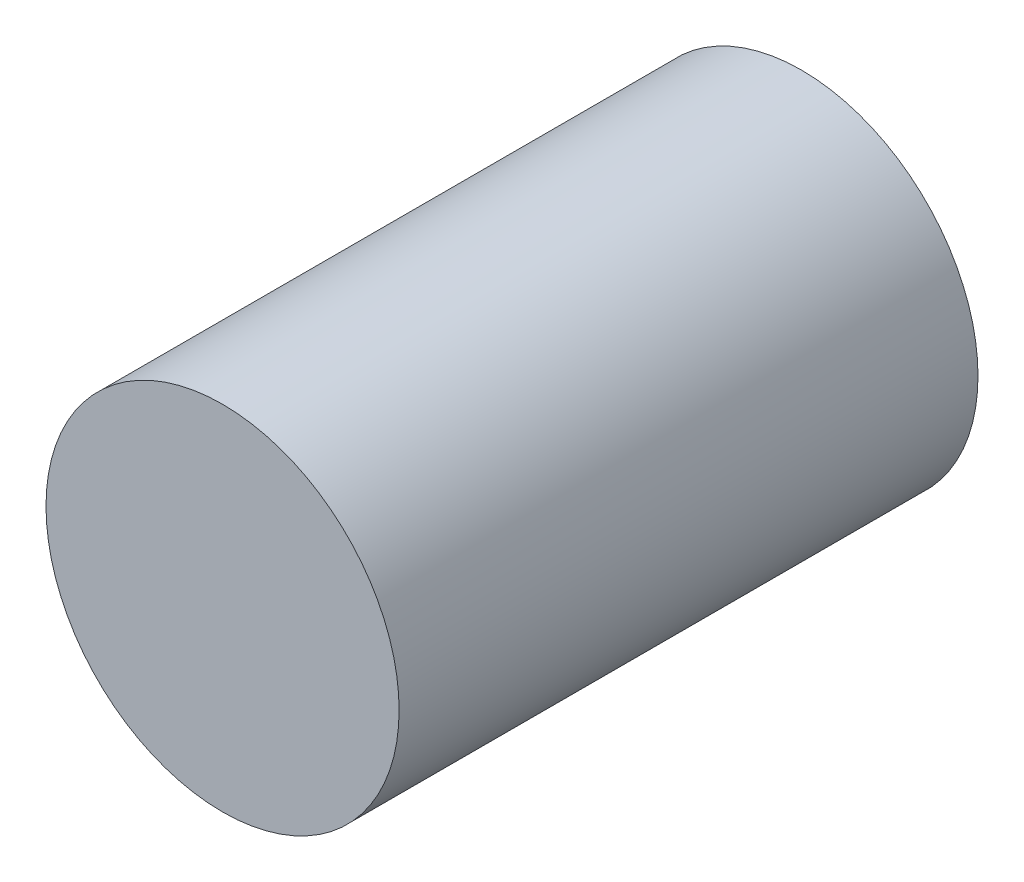
ISO-10303-21;
HEADER;
FILE_DESCRIPTION(('STEP AP214'),'2;1');
FILE_NAME('part.step','',(''),(''),'','','');
FILE_SCHEMA(('AUTOMOTIVE_DESIGN { 1 0 10303 214 1 1 1 1 }'));
ENDSEC;
DATA;
#1=APPLICATION_CONTEXT('core data for automotive mechanical design processes');
#2=APPLICATION_PROTOCOL_DEFINITION('international standard','automotive_design',2000,#1);
#3=PRODUCT_CONTEXT('',#1,'mechanical');
#4=PRODUCT('Part','Part','',(#3));
#5=PRODUCT_RELATED_PRODUCT_CATEGORY('part','',(#4));
#6=PRODUCT_DEFINITION_FORMATION('','',#4);
#7=PRODUCT_DEFINITION_CONTEXT('part definition',#1,'design');
#8=PRODUCT_DEFINITION('design','',#6,#7);
#9=PRODUCT_DEFINITION_SHAPE('','',#8);
#10=(LENGTH_UNIT() NAMED_UNIT(*) SI_UNIT(.MILLI.,.METRE.));
#11=(NAMED_UNIT(*) PLANE_ANGLE_UNIT() SI_UNIT($,.RADIAN.));
#12=(NAMED_UNIT(*) SI_UNIT($,.STERADIAN.) SOLID_ANGLE_UNIT());
#13=UNCERTAINTY_MEASURE_WITH_UNIT(LENGTH_MEASURE(1.E-05),#10,'distance_accuracy_value','');
#14=(GEOMETRIC_REPRESENTATION_CONTEXT(3) GLOBAL_UNCERTAINTY_ASSIGNED_CONTEXT((#13)) GLOBAL_UNIT_ASSIGNED_CONTEXT((#10,
#11,#12)) REPRESENTATION_CONTEXT('',''));
#15=CARTESIAN_POINT('',(0.,0.,0.));
#16=DIRECTION('',(0.,0.,1.));
#17=DIRECTION('',(1.,0.,0.));
#18=AXIS2_PLACEMENT_3D('',#15,#16,#17);
#19=CARTESIAN_POINT('',(0.,0.,100.));
#20=DIRECTION('',(0.,0.,-1.));
#21=DIRECTION('',(-1.,0.,0.));
#22=AXIS2_PLACEMENT_3D('',#19,#20,#21);
#23=CYLINDRICAL_SURFACE('',#22,61.);
#24=CARTESIAN_POINT('',(0.,0.,100.));
#25=DIRECTION('',(0.,0.,1.));
#26=DIRECTION('',(1.,0.,0.));
#27=AXIS2_PLACEMENT_3D('',#24,#25,#26);
#28=CIRCLE('',#27,61.);
#29=CARTESIAN_POINT('',(61.,0.,100.));
#30=VERTEX_POINT('',#29);
#31=EDGE_CURVE('E10',#30,#30,#28,.T.);
#32=ORIENTED_EDGE('',*,*,#31,.F.);
#33=EDGE_LOOP('',(#32));
#34=FACE_BOUND('',#33,.T.);
#35=CARTESIAN_POINT('',(0.,0.,-100.));
#36=DIRECTION('',(0.,0.,1.));
#37=DIRECTION('',(1.,0.,0.));
#38=AXIS2_PLACEMENT_3D('',#35,#36,#37);
#39=CIRCLE('',#38,61.);
#40=CARTESIAN_POINT('',(61.,0.,-100.));
#41=VERTEX_POINT('',#40);
#42=EDGE_CURVE('E52',#41,#41,#39,.T.);
#43=ORIENTED_EDGE('',*,*,#42,.T.);
#44=EDGE_LOOP('',(#43));
#45=FACE_BOUND('',#44,.T.);
#46=ADVANCED_FACE('F49',(#34,#45),#23,.T.);
#47=CARTESIAN_POINT('',(0.,0.,100.));
#48=DIRECTION('',(0.,0.,1.));
#49=DIRECTION('',(1.,0.,0.));
#50=AXIS2_PLACEMENT_3D('',#47,#48,#49);
#51=PLANE('',#50);
#52=ORIENTED_EDGE('',*,*,#31,.T.);
#53=EDGE_LOOP('',(#52));
#54=FACE_BOUND('',#53,.T.);
#55=ADVANCED_FACE('F66',(#54),#51,.T.);
#56=CARTESIAN_POINT('',(0.,0.,-100.));
#57=DIRECTION('',(0.,0.,1.));
#58=DIRECTION('',(1.,0.,0.));
#59=AXIS2_PLACEMENT_3D('',#56,#57,#58);
#60=PLANE('',#59);
#61=ORIENTED_EDGE('',*,*,#42,.F.);
#62=EDGE_LOOP('',(#61));
#63=FACE_BOUND('',#62,.T.);
#64=ADVANCED_FACE('F64',(#63),#60,.F.);
#65=CLOSED_SHELL('',(#46,#55,#64));
#66=MANIFOLD_SOLID_BREP('B2',#65);
#67=ADVANCED_BREP_SHAPE_REPRESENTATION('',(#18,#66),#14);
#68=SHAPE_DEFINITION_REPRESENTATION(#9,#67);
ENDSEC;
END-ISO-10303-21;
